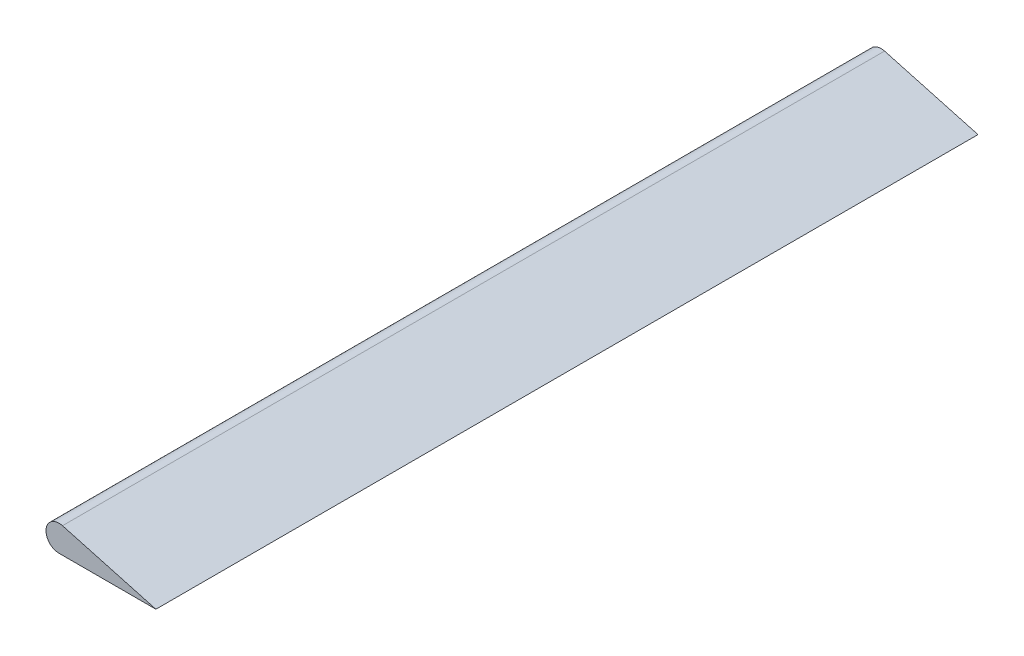
ISO-10303-21;
HEADER;
FILE_DESCRIPTION(('STEP AP214'),'2;1');
FILE_NAME('part.step','',(''),(''),'','','');
FILE_SCHEMA(('AUTOMOTIVE_DESIGN { 1 0 10303 214 1 1 1 1 }'));
ENDSEC;
DATA;
#1=APPLICATION_CONTEXT('core data for automotive mechanical design processes');
#2=APPLICATION_PROTOCOL_DEFINITION('international standard','automotive_design',2000,#1);
#3=PRODUCT_CONTEXT('',#1,'mechanical');
#4=PRODUCT('Part','Part','',(#3));
#5=PRODUCT_RELATED_PRODUCT_CATEGORY('part','',(#4));
#6=PRODUCT_DEFINITION_FORMATION('','',#4);
#7=PRODUCT_DEFINITION_CONTEXT('part definition',#1,'design');
#8=PRODUCT_DEFINITION('design','',#6,#7);
#9=PRODUCT_DEFINITION_SHAPE('','',#8);
#10=(LENGTH_UNIT() NAMED_UNIT(*) SI_UNIT(.MILLI.,.METRE.));
#11=(NAMED_UNIT(*) PLANE_ANGLE_UNIT() SI_UNIT($,.RADIAN.));
#12=(NAMED_UNIT(*) SI_UNIT($,.STERADIAN.) SOLID_ANGLE_UNIT());
#13=UNCERTAINTY_MEASURE_WITH_UNIT(LENGTH_MEASURE(1.E-05),#10,'distance_accuracy_value','');
#14=(GEOMETRIC_REPRESENTATION_CONTEXT(3) GLOBAL_UNCERTAINTY_ASSIGNED_CONTEXT((#13)) GLOBAL_UNIT_ASSIGNED_CONTEXT((#10,
#11,#12)) REPRESENTATION_CONTEXT('',''));
#15=CARTESIAN_POINT('',(0.,0.,0.));
#16=DIRECTION('',(0.,0.,1.));
#17=DIRECTION('',(1.,0.,0.));
#18=AXIS2_PLACEMENT_3D('',#15,#16,#17);
#19=CARTESIAN_POINT('',(446.391965644805,23.8886475423635,235.));
#20=DIRECTION('',(0.,0.,-1.));
#21=DIRECTION('',(-1.,0.,0.));
#22=AXIS2_PLACEMENT_3D('',#19,#20,#21);
#23=CYLINDRICAL_SURFACE('',#22,3.77619516282727);
#24=DIRECTION('',(0.,0.,-1.));
#25=VECTOR('',#24,1.);
#26=CARTESIAN_POINT('',(442.646192423976,23.4102827381828,235.));
#27=LINE('',#26,#25);
#28=CARTESIAN_POINT('',(442.646192423976,23.4102827381828,190.));
#29=VERTEX_POINT('',#28);
#30=CARTESIAN_POINT('',(442.646192423976,23.4102827381828,175.));
#31=VERTEX_POINT('',#30);
#32=EDGE_CURVE('E11',#29,#31,#27,.T.);
#33=ORIENTED_EDGE('',*,*,#32,.F.);
#34=CARTESIAN_POINT('',(446.391965644805,23.8886475423635,190.));
#35=DIRECTION('',(0.,0.,1.));
#36=DIRECTION('',(0.,-1.,0.));
#37=AXIS2_PLACEMENT_3D('',#34,#35,#36);
#38=CIRCLE('',#37,3.77619516282727);
#39=CARTESIAN_POINT('',(446.391965644805,20.1124523795362,190.));
#40=VERTEX_POINT('',#39);
#41=EDGE_CURVE('E158',#29,#40,#38,.T.);
#42=ORIENTED_EDGE('',*,*,#41,.T.);
#43=DIRECTION('',(0.,0.,-1.));
#44=VECTOR('',#43,1.);
#45=CARTESIAN_POINT('',(446.391965644805,20.1124523795362,235.));
#46=LINE('',#45,#44);
#47=CARTESIAN_POINT('',(446.391965644805,20.1124523795362,235.));
#48=VERTEX_POINT('',#47);
#49=EDGE_CURVE('E182',#48,#40,#46,.T.);
#50=ORIENTED_EDGE('',*,*,#49,.F.);
#51=CARTESIAN_POINT('',(446.391965644805,23.8886475423635,235.));
#52=DIRECTION('',(0.,0.,1.));
#53=DIRECTION('',(1.,0.,0.));
#54=AXIS2_PLACEMENT_3D('',#51,#52,#53);
#55=CIRCLE('',#54,3.77619516282727);
#56=CARTESIAN_POINT('',(447.390900991776,27.53031997139,235.));
#57=VERTEX_POINT('',#56);
#58=EDGE_CURVE('E162',#57,#48,#55,.T.);
#59=ORIENTED_EDGE('',*,*,#58,.F.);
#60=DIRECTION('',(0.,0.,-1.));
#61=VECTOR('',#60,1.);
#62=CARTESIAN_POINT('',(447.390900991776,27.53031997139,235.));
#63=LINE('',#62,#61);
#64=CARTESIAN_POINT('',(447.390900991776,27.53031997139,-3.00000000000022));
#65=VERTEX_POINT('',#64);
#66=EDGE_CURVE('E170',#57,#65,#63,.T.);
#67=ORIENTED_EDGE('',*,*,#66,.T.);
#68=CARTESIAN_POINT('',(446.391965644805,23.8886475423635,-3.00000000000022));
#69=DIRECTION('',(0.,0.,1.));
#70=DIRECTION('',(1.,0.,0.));
#71=AXIS2_PLACEMENT_3D('',#68,#69,#70);
#72=CIRCLE('',#71,3.77619516282727);
#73=CARTESIAN_POINT('',(446.391965644805,20.1124523795362,-3.00000000000022));
#74=VERTEX_POINT('',#73);
#75=EDGE_CURVE('E161',#65,#74,#72,.T.);
#76=ORIENTED_EDGE('',*,*,#75,.T.);
#77=CARTESIAN_POINT('',(446.391965644805,20.1124523795362,41.9999999999998));
#78=VERTEX_POINT('',#77);
#79=EDGE_CURVE('E181',#78,#74,#46,.T.);
#80=ORIENTED_EDGE('',*,*,#79,.F.);
#81=CARTESIAN_POINT('',(446.391965644805,23.8886475423635,41.9999999999998));
#82=DIRECTION('',(0.,0.,-1.));
#83=DIRECTION('',(-1.,0.,0.));
#84=AXIS2_PLACEMENT_3D('',#81,#82,#83);
#85=CIRCLE('',#84,3.77619516282727);
#86=CARTESIAN_POINT('',(442.646192423976,23.4102827381828,41.9999999999998));
#87=VERTEX_POINT('',#86);
#88=EDGE_CURVE('E47',#78,#87,#85,.T.);
#89=ORIENTED_EDGE('',*,*,#88,.T.);
#90=DIRECTION('',(0.,0.,-1.));
#91=VECTOR('',#90,1.);
#92=CARTESIAN_POINT('',(442.646192423976,23.4102827381828,235.));
#93=LINE('',#92,#91);
#94=CARTESIAN_POINT('',(442.646192423976,23.4102827381828,56.9999999999998));
#95=VERTEX_POINT('',#94);
#96=EDGE_CURVE('E40',#87,#95,#93,.F.);
#97=ORIENTED_EDGE('',*,*,#96,.T.);
#98=CARTESIAN_POINT('',(446.391965644805,23.8886475423635,56.9999999999998));
#99=DIRECTION('',(0.,0.,1.));
#100=DIRECTION('',(0.,-1.,0.));
#101=AXIS2_PLACEMENT_3D('',#98,#99,#100);
#102=CIRCLE('',#101,3.77619516282727);
#103=CARTESIAN_POINT('',(446.391965644805,20.1124523795362,56.9999999999998));
#104=VERTEX_POINT('',#103);
#105=EDGE_CURVE('E154',#95,#104,#102,.T.);
#106=ORIENTED_EDGE('',*,*,#105,.T.);
#107=CARTESIAN_POINT('',(446.391965644805,20.1124523795362,175.));
#108=VERTEX_POINT('',#107);
#109=EDGE_CURVE('E186',#108,#104,#46,.T.);
#110=ORIENTED_EDGE('',*,*,#109,.F.);
#111=CARTESIAN_POINT('',(446.391965644805,23.8886475423635,175.));
#112=DIRECTION('',(0.,0.,-1.));
#113=DIRECTION('',(0.,1.,0.));
#114=AXIS2_PLACEMENT_3D('',#111,#112,#113);
#115=CIRCLE('',#114,3.77619516282727);
#116=EDGE_CURVE('E55',#108,#31,#115,.T.);
#117=ORIENTED_EDGE('',*,*,#116,.T.);
#118=EDGE_LOOP('',(#33,#42,#50,#59,#67,#76,#80,#89,#97,#106,#110,#117));
#119=FACE_BOUND('',#118,.T.);
#120=ADVANCED_FACE('F33',(#119),#23,.T.);
#121=CARTESIAN_POINT('',(446.391965644805,20.1124523795362,235.));
#122=DIRECTION('',(0.,1.,0.));
#123=DIRECTION('',(-1.,0.,0.));
#124=AXIS2_PLACEMENT_3D('',#121,#122,#123);
#125=PLANE('',#124);
#126=ORIENTED_EDGE('',*,*,#49,.T.);
#127=DIRECTION('',(1.,0.,0.));
#128=VECTOR('',#127,1.);
#129=CARTESIAN_POINT('',(446.391965644805,20.1124523795362,190.));
#130=LINE('',#129,#128);
#131=CARTESIAN_POINT('',(457.615770481978,20.1124523795362,190.));
#132=VERTEX_POINT('',#131);
#133=EDGE_CURVE('E197',#40,#132,#130,.T.);
#134=ORIENTED_EDGE('',*,*,#133,.T.);
#135=DIRECTION('',(0.,0.,-1.));
#136=VECTOR('',#135,1.);
#137=CARTESIAN_POINT('',(457.615770481978,20.1124523795362,235.));
#138=LINE('',#137,#136);
#139=CARTESIAN_POINT('',(457.615770481978,20.1124523795362,175.));
#140=VERTEX_POINT('',#139);
#141=EDGE_CURVE('E195',#132,#140,#138,.T.);
#142=ORIENTED_EDGE('',*,*,#141,.T.);
#143=DIRECTION('',(-1.,0.,0.));
#144=VECTOR('',#143,1.);
#145=CARTESIAN_POINT('',(446.391965644805,20.1124523795362,175.));
#146=LINE('',#145,#144);
#147=EDGE_CURVE('E128',#140,#108,#146,.T.);
#148=ORIENTED_EDGE('',*,*,#147,.T.);
#149=ORIENTED_EDGE('',*,*,#109,.T.);
#150=DIRECTION('',(1.,0.,0.));
#151=VECTOR('',#150,1.);
#152=CARTESIAN_POINT('',(446.391965644805,20.1124523795362,56.9999999999998));
#153=LINE('',#152,#151);
#154=CARTESIAN_POINT('',(457.615770481978,20.1124523795362,56.9999999999998));
#155=VERTEX_POINT('',#154);
#156=EDGE_CURVE('E191',#104,#155,#153,.T.);
#157=ORIENTED_EDGE('',*,*,#156,.T.);
#158=DIRECTION('',(0.,0.,-1.));
#159=VECTOR('',#158,1.);
#160=CARTESIAN_POINT('',(457.615770481978,20.1124523795362,235.));
#161=LINE('',#160,#159);
#162=CARTESIAN_POINT('',(457.615770481978,20.1124523795362,41.9999999999998));
#163=VERTEX_POINT('',#162);
#164=EDGE_CURVE('E188',#155,#163,#161,.T.);
#165=ORIENTED_EDGE('',*,*,#164,.T.);
#166=DIRECTION('',(-1.,0.,0.));
#167=VECTOR('',#166,1.);
#168=CARTESIAN_POINT('',(446.391965644806,20.1124523795362,41.9999999999998));
#169=LINE('',#168,#167);
#170=EDGE_CURVE('E185',#163,#78,#169,.T.);
#171=ORIENTED_EDGE('',*,*,#170,.T.);
#172=ORIENTED_EDGE('',*,*,#79,.T.);
#173=DIRECTION('',(1.,0.,0.));
#174=VECTOR('',#173,1.);
#175=CARTESIAN_POINT('',(446.391965644805,20.1124523795362,-3.00000000000022));
#176=LINE('',#175,#174);
#177=CARTESIAN_POINT('',(474.433135480061,20.1124523795362,-3.00000000000022));
#178=VERTEX_POINT('',#177);
#179=EDGE_CURVE('E173',#74,#178,#176,.T.);
#180=ORIENTED_EDGE('',*,*,#179,.T.);
#181=DIRECTION('',(0.,0.,-1.));
#182=VECTOR('',#181,1.);
#183=CARTESIAN_POINT('',(474.433135480061,20.1124523795362,235.));
#184=LINE('',#183,#182);
#185=CARTESIAN_POINT('',(474.433135480061,20.1124523795362,235.));
#186=VERTEX_POINT('',#185);
#187=EDGE_CURVE('E178',#186,#178,#184,.T.);
#188=ORIENTED_EDGE('',*,*,#187,.F.);
#189=DIRECTION('',(1.,0.,0.));
#190=VECTOR('',#189,1.);
#191=CARTESIAN_POINT('',(446.391965644805,20.1124523795362,235.));
#192=LINE('',#191,#190);
#193=EDGE_CURVE('E165',#48,#186,#192,.T.);
#194=ORIENTED_EDGE('',*,*,#193,.F.);
#195=EDGE_LOOP('',(#126,#134,#142,#148,#149,#157,#165,#171,#172,#180,#188,#194));
#196=FACE_BOUND('',#195,.T.);
#197=ADVANCED_FACE('F215',(#196),#125,.F.);
#198=CARTESIAN_POINT('',(474.433135480061,20.1124523795362,235.));
#199=DIRECTION('',(-0.264534883367365,-0.964376117229069,0.));
#200=DIRECTION('',(0.964376117229069,-0.264534883367365,0.));
#201=AXIS2_PLACEMENT_3D('',#198,#199,#200);
#202=PLANE('',#201);
#203=DIRECTION('',(-0.964376117229069,0.264534883367365,0.));
#204=VECTOR('',#203,1.);
#205=CARTESIAN_POINT('',(474.433135480061,20.1124523795362,-3.00000000000022));
#206=LINE('',#205,#204);
#207=EDGE_CURVE('E166',#178,#65,#206,.T.);
#208=ORIENTED_EDGE('',*,*,#207,.T.);
#209=ORIENTED_EDGE('',*,*,#66,.F.);
#210=DIRECTION('',(-0.964376117229069,0.264534883367365,0.));
#211=VECTOR('',#210,1.);
#212=CARTESIAN_POINT('',(474.433135480061,20.1124523795362,235.));
#213=LINE('',#212,#211);
#214=EDGE_CURVE('E168',#186,#57,#213,.T.);
#215=ORIENTED_EDGE('',*,*,#214,.F.);
#216=ORIENTED_EDGE('',*,*,#187,.T.);
#217=EDGE_LOOP('',(#208,#209,#215,#216));
#218=FACE_BOUND('',#217,.T.);
#219=ADVANCED_FACE('F227',(#218),#202,.F.);
#220=CARTESIAN_POINT('',(446.391965644805,23.8886475423635,235.));
#221=DIRECTION('',(0.,0.,1.));
#222=DIRECTION('',(1.,0.,0.));
#223=AXIS2_PLACEMENT_3D('',#220,#221,#222);
#224=PLANE('',#223);
#225=ORIENTED_EDGE('',*,*,#58,.T.);
#226=ORIENTED_EDGE('',*,*,#193,.T.);
#227=ORIENTED_EDGE('',*,*,#214,.T.);
#228=EDGE_LOOP('',(#225,#226,#227));
#229=FACE_BOUND('',#228,.T.);
#230=ADVANCED_FACE('F229',(#229),#224,.T.);
#231=CARTESIAN_POINT('',(446.391965644805,23.8886475423635,-3.00000000000022));
#232=DIRECTION('',(0.,0.,1.));
#233=DIRECTION('',(1.,0.,0.));
#234=AXIS2_PLACEMENT_3D('',#231,#232,#233);
#235=PLANE('',#234);
#236=ORIENTED_EDGE('',*,*,#75,.F.);
#237=ORIENTED_EDGE('',*,*,#207,.F.);
#238=ORIENTED_EDGE('',*,*,#179,.F.);
#239=EDGE_LOOP('',(#236,#237,#238));
#240=FACE_BOUND('',#239,.T.);
#241=ADVANCED_FACE('F221',(#240),#235,.F.);
#242=CARTESIAN_POINT('',(0.,23.4102827381828,0.));
#243=DIRECTION('',(0.,1.,0.));
#244=DIRECTION('',(0.,0.,1.));
#245=AXIS2_PLACEMENT_3D('',#242,#243,#244);
#246=PLANE('',#245);
#247=DIRECTION('',(1.,0.,0.));
#248=VECTOR('',#247,1.);
#249=CARTESIAN_POINT('',(442.615770481978,23.4102827381828,41.9999999999998));
#250=LINE('',#249,#248);
#251=CARTESIAN_POINT('',(457.615770481978,23.4102827381828,41.9999999999998));
#252=VERTEX_POINT('',#251);
#253=EDGE_CURVE('E140',#87,#252,#250,.T.);
#254=ORIENTED_EDGE('',*,*,#253,.T.);
#255=DIRECTION('',(0.,0.,1.));
#256=VECTOR('',#255,1.);
#257=CARTESIAN_POINT('',(457.615770481978,23.4102827381828,41.9999999999998));
#258=LINE('',#257,#256);
#259=CARTESIAN_POINT('',(457.615770481978,23.4102827381828,56.9999999999998));
#260=VERTEX_POINT('',#259);
#261=EDGE_CURVE('E142',#252,#260,#258,.T.);
#262=ORIENTED_EDGE('',*,*,#261,.T.);
#263=DIRECTION('',(-1.,0.,0.));
#264=VECTOR('',#263,1.);
#265=CARTESIAN_POINT('',(442.615770481978,23.4102827381828,56.9999999999998));
#266=LINE('',#265,#264);
#267=EDGE_CURVE('E145',#260,#95,#266,.T.);
#268=ORIENTED_EDGE('',*,*,#267,.T.);
#269=ORIENTED_EDGE('',*,*,#96,.F.);
#270=EDGE_LOOP('',(#254,#262,#268,#269));
#271=FACE_BOUND('',#270,.T.);
#272=ADVANCED_FACE('F205',(#271),#246,.F.);
#273=CARTESIAN_POINT('',(442.615770481978,23.4102827381828,56.9999999999998));
#274=DIRECTION('',(0.,0.,1.));
#275=DIRECTION('',(0.,-1.,0.));
#276=AXIS2_PLACEMENT_3D('',#273,#274,#275);
#277=PLANE('',#276);
#278=ORIENTED_EDGE('',*,*,#267,.F.);
#279=DIRECTION('',(0.,-1.,0.));
#280=VECTOR('',#279,1.);
#281=CARTESIAN_POINT('',(457.615770481978,23.4102827381828,56.9999999999998));
#282=LINE('',#281,#280);
#283=EDGE_CURVE('E123',#260,#155,#282,.T.);
#284=ORIENTED_EDGE('',*,*,#283,.T.);
#285=ORIENTED_EDGE('',*,*,#156,.F.);
#286=ORIENTED_EDGE('',*,*,#105,.F.);
#287=EDGE_LOOP('',(#278,#284,#285,#286));
#288=FACE_BOUND('',#287,.T.);
#289=ADVANCED_FACE('F213',(#288),#277,.F.);
#290=CARTESIAN_POINT('',(457.615770481978,23.4102827381828,41.9999999999998));
#291=DIRECTION('',(1.,0.,0.));
#292=DIRECTION('',(0.,0.,-1.));
#293=AXIS2_PLACEMENT_3D('',#290,#291,#292);
#294=PLANE('',#293);
#295=ORIENTED_EDGE('',*,*,#283,.F.);
#296=ORIENTED_EDGE('',*,*,#261,.F.);
#297=DIRECTION('',(0.,-1.,0.));
#298=VECTOR('',#297,1.);
#299=CARTESIAN_POINT('',(457.615770481978,23.4102827381828,41.9999999999998));
#300=LINE('',#299,#298);
#301=EDGE_CURVE('E148',#252,#163,#300,.T.);
#302=ORIENTED_EDGE('',*,*,#301,.T.);
#303=ORIENTED_EDGE('',*,*,#164,.F.);
#304=EDGE_LOOP('',(#295,#296,#302,#303));
#305=FACE_BOUND('',#304,.T.);
#306=ADVANCED_FACE('F211',(#305),#294,.F.);
#307=CARTESIAN_POINT('',(442.615770481978,23.4102827381828,41.9999999999998));
#308=DIRECTION('',(0.,0.,-1.));
#309=DIRECTION('',(-1.,0.,0.));
#310=AXIS2_PLACEMENT_3D('',#307,#308,#309);
#311=PLANE('',#310);
#312=ORIENTED_EDGE('',*,*,#170,.F.);
#313=ORIENTED_EDGE('',*,*,#301,.F.);
#314=ORIENTED_EDGE('',*,*,#253,.F.);
#315=ORIENTED_EDGE('',*,*,#88,.F.);
#316=EDGE_LOOP('',(#312,#313,#314,#315));
#317=FACE_BOUND('',#316,.T.);
#318=ADVANCED_FACE('F208',(#317),#311,.F.);
#319=CARTESIAN_POINT('',(0.,23.4102827381828,0.));
#320=DIRECTION('',(0.,-1.,0.));
#321=DIRECTION('',(0.,0.,-1.));
#322=AXIS2_PLACEMENT_3D('',#319,#320,#321);
#323=PLANE('',#322);
#324=ORIENTED_EDGE('',*,*,#32,.T.);
#325=DIRECTION('',(1.,0.,0.));
#326=VECTOR('',#325,1.);
#327=CARTESIAN_POINT('',(442.615770481978,23.4102827381828,175.));
#328=LINE('',#327,#326);
#329=CARTESIAN_POINT('',(457.615770481978,23.4102827381828,175.));
#330=VERTEX_POINT('',#329);
#331=EDGE_CURVE('E115',#31,#330,#328,.T.);
#332=ORIENTED_EDGE('',*,*,#331,.T.);
#333=DIRECTION('',(0.,0.,1.));
#334=VECTOR('',#333,1.);
#335=CARTESIAN_POINT('',(457.615770481978,23.4102827381828,190.));
#336=LINE('',#335,#334);
#337=CARTESIAN_POINT('',(457.615770481978,23.4102827381828,190.));
#338=VERTEX_POINT('',#337);
#339=EDGE_CURVE('E120',#330,#338,#336,.T.);
#340=ORIENTED_EDGE('',*,*,#339,.T.);
#341=DIRECTION('',(-1.,0.,0.));
#342=VECTOR('',#341,1.);
#343=CARTESIAN_POINT('',(442.615770481978,23.4102827381828,190.));
#344=LINE('',#343,#342);
#345=EDGE_CURVE('E132',#338,#29,#344,.T.);
#346=ORIENTED_EDGE('',*,*,#345,.T.);
#347=EDGE_LOOP('',(#324,#332,#340,#346));
#348=FACE_BOUND('',#347,.T.);
#349=ADVANCED_FACE('F117',(#348),#323,.T.);
#350=CARTESIAN_POINT('',(442.615770481978,23.4102827381828,190.));
#351=DIRECTION('',(0.,0.,1.));
#352=DIRECTION('',(0.,-1.,0.));
#353=AXIS2_PLACEMENT_3D('',#350,#351,#352);
#354=PLANE('',#353);
#355=ORIENTED_EDGE('',*,*,#345,.F.);
#356=DIRECTION('',(0.,-1.,0.));
#357=VECTOR('',#356,1.);
#358=CARTESIAN_POINT('',(457.615770481978,23.4102827381828,190.));
#359=LINE('',#358,#357);
#360=EDGE_CURVE('E131',#338,#132,#359,.T.);
#361=ORIENTED_EDGE('',*,*,#360,.T.);
#362=ORIENTED_EDGE('',*,*,#133,.F.);
#363=ORIENTED_EDGE('',*,*,#41,.F.);
#364=EDGE_LOOP('',(#355,#361,#362,#363));
#365=FACE_BOUND('',#364,.T.);
#366=ADVANCED_FACE('F231',(#365),#354,.F.);
#367=CARTESIAN_POINT('',(457.615770481978,23.4102827381828,190.));
#368=DIRECTION('',(1.,0.,0.));
#369=DIRECTION('',(0.,0.,-1.));
#370=AXIS2_PLACEMENT_3D('',#367,#368,#369);
#371=PLANE('',#370);
#372=ORIENTED_EDGE('',*,*,#360,.F.);
#373=ORIENTED_EDGE('',*,*,#339,.F.);
#374=DIRECTION('',(0.,-1.,0.));
#375=VECTOR('',#374,1.);
#376=CARTESIAN_POINT('',(457.615770481978,23.4102827381828,175.));
#377=LINE('',#376,#375);
#378=EDGE_CURVE('E126',#330,#140,#377,.T.);
#379=ORIENTED_EDGE('',*,*,#378,.T.);
#380=ORIENTED_EDGE('',*,*,#141,.F.);
#381=EDGE_LOOP('',(#372,#373,#379,#380));
#382=FACE_BOUND('',#381,.T.);
#383=ADVANCED_FACE('F134',(#382),#371,.F.);
#384=CARTESIAN_POINT('',(442.615770481978,23.4102827381828,175.));
#385=DIRECTION('',(0.,0.,-1.));
#386=DIRECTION('',(0.,1.,0.));
#387=AXIS2_PLACEMENT_3D('',#384,#385,#386);
#388=PLANE('',#387);
#389=ORIENTED_EDGE('',*,*,#147,.F.);
#390=ORIENTED_EDGE('',*,*,#378,.F.);
#391=ORIENTED_EDGE('',*,*,#331,.F.);
#392=ORIENTED_EDGE('',*,*,#116,.F.);
#393=EDGE_LOOP('',(#389,#390,#391,#392));
#394=FACE_BOUND('',#393,.T.);
#395=ADVANCED_FACE('F127',(#394),#388,.F.);
#396=CLOSED_SHELL('',(#120,#197,#219,#230,#241,#272,#289,#306,#318,#349,#366,#383,#395));
#397=MANIFOLD_SOLID_BREP('B2',#396);
#398=ADVANCED_BREP_SHAPE_REPRESENTATION('',(#18,#397),#14);
#399=SHAPE_DEFINITION_REPRESENTATION(#9,#398);
ENDSEC;
END-ISO-10303-21;
